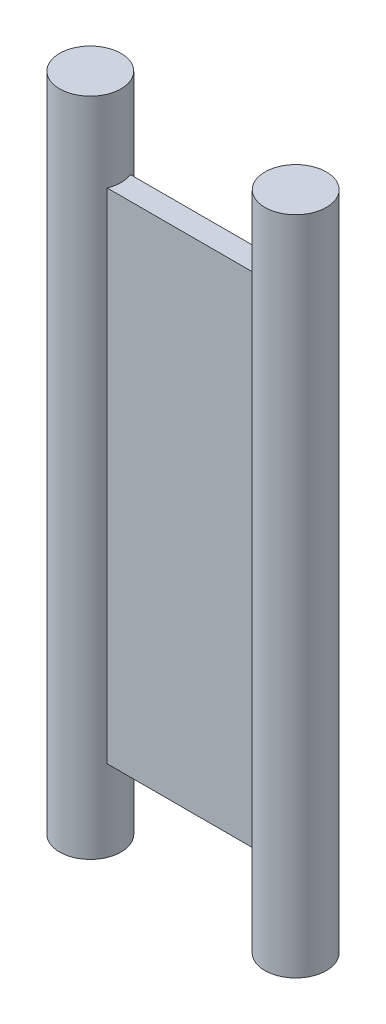
ISO-10303-21;
HEADER;
FILE_DESCRIPTION(('STEP AP214'),'2;1');
FILE_NAME('part.step','',(''),(''),'','','');
FILE_SCHEMA(('AUTOMOTIVE_DESIGN { 1 0 10303 214 1 1 1 1 }'));
ENDSEC;
DATA;
#1=APPLICATION_CONTEXT('core data for automotive mechanical design processes');
#2=APPLICATION_PROTOCOL_DEFINITION('international standard','automotive_design',2000,#1);
#3=PRODUCT_CONTEXT('',#1,'mechanical');
#4=PRODUCT('Part','Part','',(#3));
#5=PRODUCT_RELATED_PRODUCT_CATEGORY('part','',(#4));
#6=PRODUCT_DEFINITION_FORMATION('','',#4);
#7=PRODUCT_DEFINITION_CONTEXT('part definition',#1,'design');
#8=PRODUCT_DEFINITION('design','',#6,#7);
#9=PRODUCT_DEFINITION_SHAPE('','',#8);
#10=(LENGTH_UNIT() NAMED_UNIT(*) SI_UNIT(.MILLI.,.METRE.));
#11=(NAMED_UNIT(*) PLANE_ANGLE_UNIT() SI_UNIT($,.RADIAN.));
#12=(NAMED_UNIT(*) SI_UNIT($,.STERADIAN.) SOLID_ANGLE_UNIT());
#13=UNCERTAINTY_MEASURE_WITH_UNIT(LENGTH_MEASURE(1.E-05),#10,'distance_accuracy_value','');
#14=(GEOMETRIC_REPRESENTATION_CONTEXT(3) GLOBAL_UNCERTAINTY_ASSIGNED_CONTEXT((#13)) GLOBAL_UNIT_ASSIGNED_CONTEXT((#10,
#11,#12)) REPRESENTATION_CONTEXT('',''));
#15=CARTESIAN_POINT('',(0.,0.,0.));
#16=DIRECTION('',(0.,0.,1.));
#17=DIRECTION('',(1.,0.,0.));
#18=AXIS2_PLACEMENT_3D('',#15,#16,#17);
#19=CARTESIAN_POINT('',(4.427,21.5,0.5));
#20=DIRECTION('',(0.,0.,-1.));
#21=DIRECTION('',(-1.,0.,0.));
#22=AXIS2_PLACEMENT_3D('',#19,#20,#21);
#23=PLANE('',#22);
#24=DIRECTION('',(0.,-1.,0.));
#25=VECTOR('',#24,1.);
#26=CARTESIAN_POINT('',(3.1999608808192,25.,0.5));
#27=LINE('',#26,#25);
#28=CARTESIAN_POINT('',(3.1999608808192,21.5,0.5));
#29=VERTEX_POINT('',#28);
#30=CARTESIAN_POINT('',(3.1999608808192,0.,0.5));
#31=VERTEX_POINT('',#30);
#32=EDGE_CURVE('E53',#29,#31,#27,.T.);
#33=ORIENTED_EDGE('',*,*,#32,.F.);
#34=DIRECTION('',(1.,0.,0.));
#35=VECTOR('',#34,1.);
#36=CARTESIAN_POINT('',(4.427,21.5,0.5));
#37=LINE('',#36,#35);
#38=CARTESIAN_POINT('',(-3.1999608808192,21.5,0.500000000000001));
#39=VERTEX_POINT('',#38);
#40=EDGE_CURVE('E90',#39,#29,#37,.T.);
#41=ORIENTED_EDGE('',*,*,#40,.F.);
#42=DIRECTION('',(0.,-1.,0.));
#43=VECTOR('',#42,1.);
#44=CARTESIAN_POINT('',(-3.1999608808192,25.,0.500000000000001));
#45=LINE('',#44,#43);
#46=CARTESIAN_POINT('',(-3.1999608808192,0.,0.500000000000001));
#47=VERTEX_POINT('',#46);
#48=EDGE_CURVE('E103',#47,#39,#45,.F.);
#49=ORIENTED_EDGE('',*,*,#48,.F.);
#50=DIRECTION('',(1.,0.,0.));
#51=VECTOR('',#50,1.);
#52=CARTESIAN_POINT('',(4.427,0.,0.5));
#53=LINE('',#52,#51);
#54=EDGE_CURVE('E91',#47,#31,#53,.T.);
#55=ORIENTED_EDGE('',*,*,#54,.T.);
#56=EDGE_LOOP('',(#33,#41,#49,#55));
#57=FACE_BOUND('',#56,.T.);
#58=ADVANCED_FACE('F39',(#57),#23,.F.);
#59=CARTESIAN_POINT('',(4.427,21.5,-0.500000000000001));
#60=DIRECTION('',(0.,0.,1.));
#61=DIRECTION('',(1.,0.,0.));
#62=AXIS2_PLACEMENT_3D('',#59,#60,#61);
#63=PLANE('',#62);
#64=DIRECTION('',(0.,-1.,0.));
#65=VECTOR('',#64,1.);
#66=CARTESIAN_POINT('',(3.1999608808192,25.,-0.5));
#67=LINE('',#66,#65);
#68=CARTESIAN_POINT('',(3.1999608808192,0.,-0.5));
#69=VERTEX_POINT('',#68);
#70=CARTESIAN_POINT('',(3.1999608808192,21.5,-0.5));
#71=VERTEX_POINT('',#70);
#72=EDGE_CURVE('E78',#69,#71,#67,.F.);
#73=ORIENTED_EDGE('',*,*,#72,.F.);
#74=DIRECTION('',(-1.,0.,0.));
#75=VECTOR('',#74,1.);
#76=CARTESIAN_POINT('',(4.427,0.,-0.500000000000001));
#77=LINE('',#76,#75);
#78=CARTESIAN_POINT('',(-3.1999608808192,0.,-0.5));
#79=VERTEX_POINT('',#78);
#80=EDGE_CURVE('E60',#69,#79,#77,.T.);
#81=ORIENTED_EDGE('',*,*,#80,.T.);
#82=DIRECTION('',(0.,-1.,0.));
#83=VECTOR('',#82,1.);
#84=CARTESIAN_POINT('',(-3.1999608808192,25.,-0.5));
#85=LINE('',#84,#83);
#86=CARTESIAN_POINT('',(-3.1999608808192,21.5,-0.5));
#87=VERTEX_POINT('',#86);
#88=EDGE_CURVE('E105',#87,#79,#85,.T.);
#89=ORIENTED_EDGE('',*,*,#88,.F.);
#90=DIRECTION('',(-1.,0.,0.));
#91=VECTOR('',#90,1.);
#92=CARTESIAN_POINT('',(4.427,21.5,-0.500000000000001));
#93=LINE('',#92,#91);
#94=EDGE_CURVE('E85',#71,#87,#93,.T.);
#95=ORIENTED_EDGE('',*,*,#94,.F.);
#96=EDGE_LOOP('',(#73,#81,#89,#95));
#97=FACE_BOUND('',#96,.T.);
#98=ADVANCED_FACE('F84',(#97),#63,.F.);
#99=CARTESIAN_POINT('',(-4.427,25.,0.));
#100=DIRECTION('',(0.,-1.,0.));
#101=DIRECTION('',(0.,0.,-1.));
#102=AXIS2_PLACEMENT_3D('',#99,#100,#101);
#103=CYLINDRICAL_SURFACE('',#102,1.325);
#104=CARTESIAN_POINT('',(-4.427,25.,0.));
#105=DIRECTION('',(0.,1.,0.));
#106=DIRECTION('',(0.,0.,1.));
#107=AXIS2_PLACEMENT_3D('',#104,#105,#106);
#108=CIRCLE('',#107,1.325);
#109=CARTESIAN_POINT('',(-4.427,25.,1.325));
#110=VERTEX_POINT('',#109);
#111=EDGE_CURVE('E107',#110,#110,#108,.T.);
#112=ORIENTED_EDGE('',*,*,#111,.F.);
#113=EDGE_LOOP('',(#112));
#114=FACE_BOUND('',#113,.T.);
#115=CARTESIAN_POINT('',(-4.427,-3.5,0.));
#116=DIRECTION('',(0.,1.,0.));
#117=DIRECTION('',(0.,0.,1.));
#118=AXIS2_PLACEMENT_3D('',#115,#116,#117);
#119=CIRCLE('',#118,1.325);
#120=CARTESIAN_POINT('',(-4.427,-3.5,1.325));
#121=VERTEX_POINT('',#120);
#122=EDGE_CURVE('E108',#121,#121,#119,.T.);
#123=ORIENTED_EDGE('',*,*,#122,.T.);
#124=EDGE_LOOP('',(#123));
#125=FACE_BOUND('',#124,.T.);
#126=ORIENTED_EDGE('',*,*,#48,.T.);
#127=CARTESIAN_POINT('',(-4.427,21.5,0.));
#128=DIRECTION('',(0.,-1.,0.));
#129=DIRECTION('',(0.,0.,-1.));
#130=AXIS2_PLACEMENT_3D('',#127,#128,#129);
#131=CIRCLE('',#130,1.325);
#132=EDGE_CURVE('E95',#39,#87,#131,.F.);
#133=ORIENTED_EDGE('',*,*,#132,.T.);
#134=ORIENTED_EDGE('',*,*,#88,.T.);
#135=CARTESIAN_POINT('',(-4.427,0.,0.));
#136=DIRECTION('',(0.,-1.,0.));
#137=DIRECTION('',(0.,0.,-1.));
#138=AXIS2_PLACEMENT_3D('',#135,#136,#137);
#139=CIRCLE('',#138,1.325);
#140=EDGE_CURVE('E46',#47,#79,#139,.F.);
#141=ORIENTED_EDGE('',*,*,#140,.F.);
#142=EDGE_LOOP('',(#126,#133,#134,#141));
#143=FACE_BOUND('',#142,.T.);
#144=ADVANCED_FACE('F138',(#114,#125,#143),#103,.T.);
#145=CARTESIAN_POINT('',(-4.427,25.,0.));
#146=DIRECTION('',(0.,1.,0.));
#147=DIRECTION('',(0.,0.,1.));
#148=AXIS2_PLACEMENT_3D('',#145,#146,#147);
#149=PLANE('',#148);
#150=ORIENTED_EDGE('',*,*,#111,.T.);
#151=EDGE_LOOP('',(#150));
#152=FACE_BOUND('',#151,.T.);
#153=ADVANCED_FACE('F144',(#152),#149,.T.);
#154=CARTESIAN_POINT('',(-4.427,-3.5,0.));
#155=DIRECTION('',(0.,1.,0.));
#156=DIRECTION('',(0.,0.,1.));
#157=AXIS2_PLACEMENT_3D('',#154,#155,#156);
#158=PLANE('',#157);
#159=ORIENTED_EDGE('',*,*,#122,.F.);
#160=EDGE_LOOP('',(#159));
#161=FACE_BOUND('',#160,.T.);
#162=ADVANCED_FACE('F150',(#161),#158,.F.);
#163=CARTESIAN_POINT('',(0.,21.5,0.));
#164=DIRECTION('',(0.,-1.,0.));
#165=DIRECTION('',(0.,0.,-1.));
#166=AXIS2_PLACEMENT_3D('',#163,#164,#165);
#167=PLANE('',#166);
#168=CARTESIAN_POINT('',(4.427,21.5,0.));
#169=DIRECTION('',(0.,-1.,0.));
#170=DIRECTION('',(0.,0.,-1.));
#171=AXIS2_PLACEMENT_3D('',#168,#169,#170);
#172=CIRCLE('',#171,1.325);
#173=EDGE_CURVE('E111',#71,#29,#172,.F.);
#174=ORIENTED_EDGE('',*,*,#173,.F.);
#175=ORIENTED_EDGE('',*,*,#94,.T.);
#176=ORIENTED_EDGE('',*,*,#132,.F.);
#177=ORIENTED_EDGE('',*,*,#40,.T.);
#178=EDGE_LOOP('',(#174,#175,#176,#177));
#179=FACE_BOUND('',#178,.T.);
#180=ADVANCED_FACE('F141',(#179),#167,.F.);
#181=CARTESIAN_POINT('',(0.,0.,0.));
#182=DIRECTION('',(0.,-1.,0.));
#183=DIRECTION('',(0.,0.,-1.));
#184=AXIS2_PLACEMENT_3D('',#181,#182,#183);
#185=PLANE('',#184);
#186=ORIENTED_EDGE('',*,*,#80,.F.);
#187=CARTESIAN_POINT('',(4.427,0.,0.));
#188=DIRECTION('',(0.,-1.,0.));
#189=DIRECTION('',(0.,0.,-1.));
#190=AXIS2_PLACEMENT_3D('',#187,#188,#189);
#191=CIRCLE('',#190,1.325);
#192=EDGE_CURVE('E11',#69,#31,#191,.F.);
#193=ORIENTED_EDGE('',*,*,#192,.T.);
#194=ORIENTED_EDGE('',*,*,#54,.F.);
#195=ORIENTED_EDGE('',*,*,#140,.T.);
#196=EDGE_LOOP('',(#186,#193,#194,#195));
#197=FACE_BOUND('',#196,.T.);
#198=ADVANCED_FACE('F89',(#197),#185,.T.);
#199=CARTESIAN_POINT('',(4.427,25.,0.));
#200=DIRECTION('',(0.,-1.,0.));
#201=DIRECTION('',(0.,0.,-1.));
#202=AXIS2_PLACEMENT_3D('',#199,#200,#201);
#203=CYLINDRICAL_SURFACE('',#202,1.325);
#204=CARTESIAN_POINT('',(4.427,25.,0.));
#205=DIRECTION('',(0.,1.,0.));
#206=DIRECTION('',(0.,0.,1.));
#207=AXIS2_PLACEMENT_3D('',#204,#205,#206);
#208=CIRCLE('',#207,1.325);
#209=CARTESIAN_POINT('',(4.427,25.,1.325));
#210=VERTEX_POINT('',#209);
#211=EDGE_CURVE('E116',#210,#210,#208,.T.);
#212=ORIENTED_EDGE('',*,*,#211,.F.);
#213=EDGE_LOOP('',(#212));
#214=FACE_BOUND('',#213,.T.);
#215=CARTESIAN_POINT('',(4.427,-3.5,0.));
#216=DIRECTION('',(0.,1.,0.));
#217=DIRECTION('',(0.,0.,1.));
#218=AXIS2_PLACEMENT_3D('',#215,#216,#217);
#219=CIRCLE('',#218,1.325);
#220=CARTESIAN_POINT('',(4.427,-3.5,1.325));
#221=VERTEX_POINT('',#220);
#222=EDGE_CURVE('E86',#221,#221,#219,.T.);
#223=ORIENTED_EDGE('',*,*,#222,.T.);
#224=EDGE_LOOP('',(#223));
#225=FACE_BOUND('',#224,.T.);
#226=ORIENTED_EDGE('',*,*,#72,.T.);
#227=ORIENTED_EDGE('',*,*,#173,.T.);
#228=ORIENTED_EDGE('',*,*,#32,.T.);
#229=ORIENTED_EDGE('',*,*,#192,.F.);
#230=EDGE_LOOP('',(#226,#227,#228,#229));
#231=FACE_BOUND('',#230,.T.);
#232=ADVANCED_FACE('F77',(#214,#225,#231),#203,.T.);
#233=CARTESIAN_POINT('',(4.427,25.,0.));
#234=DIRECTION('',(0.,1.,0.));
#235=DIRECTION('',(0.,0.,1.));
#236=AXIS2_PLACEMENT_3D('',#233,#234,#235);
#237=PLANE('',#236);
#238=ORIENTED_EDGE('',*,*,#211,.T.);
#239=EDGE_LOOP('',(#238));
#240=FACE_BOUND('',#239,.T.);
#241=ADVANCED_FACE('F125',(#240),#237,.T.);
#242=CARTESIAN_POINT('',(4.427,-3.5,0.));
#243=DIRECTION('',(0.,1.,0.));
#244=DIRECTION('',(0.,0.,1.));
#245=AXIS2_PLACEMENT_3D('',#242,#243,#244);
#246=PLANE('',#245);
#247=ORIENTED_EDGE('',*,*,#222,.F.);
#248=EDGE_LOOP('',(#247));
#249=FACE_BOUND('',#248,.T.);
#250=ADVANCED_FACE('F123',(#249),#246,.F.);
#251=CLOSED_SHELL('',(#58,#98,#144,#153,#162,#180,#198,#232,#241,#250));
#252=MANIFOLD_SOLID_BREP('B2',#251);
#253=ADVANCED_BREP_SHAPE_REPRESENTATION('',(#18,#252),#14);
#254=SHAPE_DEFINITION_REPRESENTATION(#9,#253);
ENDSEC;
END-ISO-10303-21;
